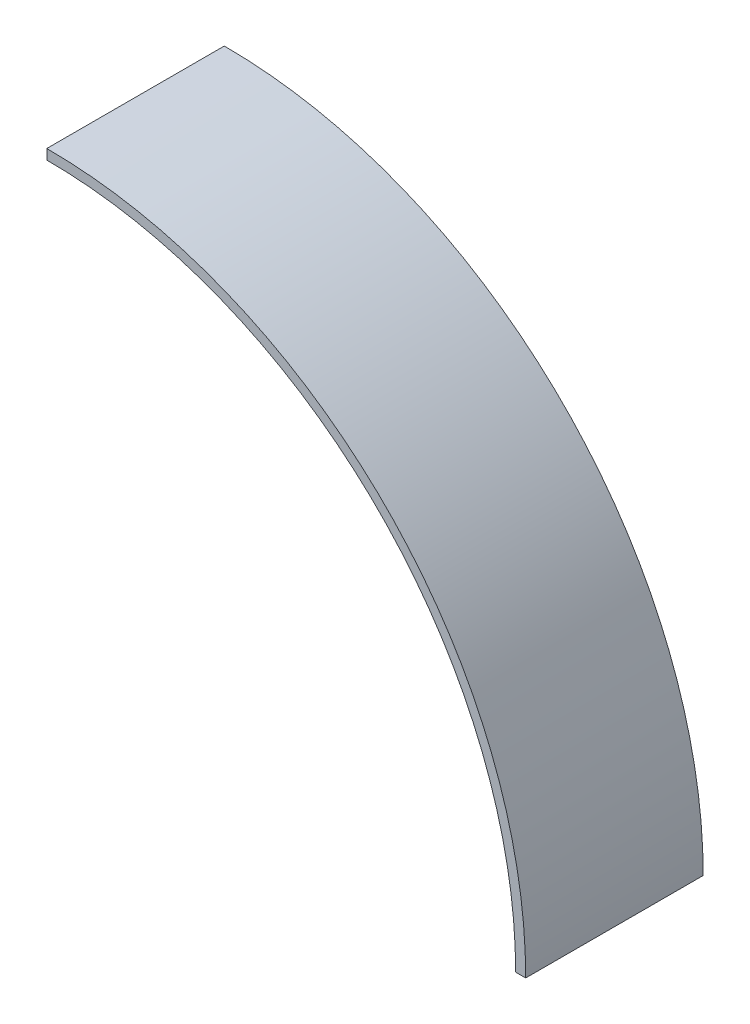
ISO-10303-21;
HEADER;
FILE_DESCRIPTION(('STEP AP214'),'2;1');
FILE_NAME('part.step','',(''),(''),'','','');
FILE_SCHEMA(('AUTOMOTIVE_DESIGN { 1 0 10303 214 1 1 1 1 }'));
ENDSEC;
DATA;
#1=APPLICATION_CONTEXT('core data for automotive mechanical design processes');
#2=APPLICATION_PROTOCOL_DEFINITION('international standard','automotive_design',2000,#1);
#3=PRODUCT_CONTEXT('',#1,'mechanical');
#4=PRODUCT('Part','Part','',(#3));
#5=PRODUCT_RELATED_PRODUCT_CATEGORY('part','',(#4));
#6=PRODUCT_DEFINITION_FORMATION('','',#4);
#7=PRODUCT_DEFINITION_CONTEXT('part definition',#1,'design');
#8=PRODUCT_DEFINITION('design','',#6,#7);
#9=PRODUCT_DEFINITION_SHAPE('','',#8);
#10=(LENGTH_UNIT() NAMED_UNIT(*) SI_UNIT(.MILLI.,.METRE.));
#11=(NAMED_UNIT(*) PLANE_ANGLE_UNIT() SI_UNIT($,.RADIAN.));
#12=(NAMED_UNIT(*) SI_UNIT($,.STERADIAN.) SOLID_ANGLE_UNIT());
#13=UNCERTAINTY_MEASURE_WITH_UNIT(LENGTH_MEASURE(1.E-05),#10,'distance_accuracy_value','');
#14=(GEOMETRIC_REPRESENTATION_CONTEXT(3) GLOBAL_UNCERTAINTY_ASSIGNED_CONTEXT((#13)) GLOBAL_UNIT_ASSIGNED_CONTEXT((#10,
#11,#12)) REPRESENTATION_CONTEXT('',''));
#15=CARTESIAN_POINT('',(0.,0.,0.));
#16=DIRECTION('',(0.,0.,1.));
#17=DIRECTION('',(1.,0.,0.));
#18=AXIS2_PLACEMENT_3D('',#15,#16,#17);
#19=CARTESIAN_POINT('',(199.01,190.,1.49999999999995));
#20=DIRECTION('',(0.,-1.,0.));
#21=DIRECTION('',(1.,0.,0.));
#22=AXIS2_PLACEMENT_3D('',#19,#20,#21);
#23=PLANE('',#22);
#24=DIRECTION('',(0.,0.,1.));
#25=VECTOR('',#24,1.);
#26=CARTESIAN_POINT('',(170.5,190.,872.));
#27=LINE('',#26,#25);
#28=CARTESIAN_POINT('',(170.5,190.,1.49999999999995));
#29=VERTEX_POINT('',#28);
#30=CARTESIAN_POINT('',(170.5,190.,28.));
#31=VERTEX_POINT('',#30);
#32=EDGE_CURVE('E43',#29,#31,#27,.T.);
#33=ORIENTED_EDGE('',*,*,#32,.T.);
#34=DIRECTION('',(1.,0.,0.));
#35=VECTOR('',#34,1.);
#36=CARTESIAN_POINT('',(99.,190.,28.));
#37=LINE('',#36,#35);
#38=CARTESIAN_POINT('',(169.,190.,28.));
#39=VERTEX_POINT('',#38);
#40=EDGE_CURVE('E94',#39,#31,#37,.T.);
#41=ORIENTED_EDGE('',*,*,#40,.F.);
#42=DIRECTION('',(0.,0.,1.));
#43=VECTOR('',#42,1.);
#44=CARTESIAN_POINT('',(169.,190.,0.));
#45=LINE('',#44,#43);
#46=CARTESIAN_POINT('',(169.,190.,1.49999999999995));
#47=VERTEX_POINT('',#46);
#48=EDGE_CURVE('E93',#47,#39,#45,.T.);
#49=ORIENTED_EDGE('',*,*,#48,.F.);
#50=DIRECTION('',(1.,0.,0.));
#51=VECTOR('',#50,1.);
#52=CARTESIAN_POINT('',(170.5,190.,1.49999999999995));
#53=LINE('',#52,#51);
#54=EDGE_CURVE('E85',#47,#29,#53,.T.);
#55=ORIENTED_EDGE('',*,*,#54,.T.);
#56=EDGE_LOOP('',(#33,#41,#49,#55));
#57=FACE_BOUND('',#56,.T.);
#58=ADVANCED_FACE('F39',(#57),#23,.T.);
#59=CARTESIAN_POINT('',(99.,190.,28.));
#60=DIRECTION('',(0.,0.,1.));
#61=DIRECTION('',(1.,0.,0.));
#62=AXIS2_PLACEMENT_3D('',#59,#60,#61);
#63=PLANE('',#62);
#64=CARTESIAN_POINT('',(99.,190.,28.));
#65=DIRECTION('',(0.,0.,1.));
#66=DIRECTION('',(1.,0.,0.));
#67=AXIS2_PLACEMENT_3D('',#64,#65,#66);
#68=CIRCLE('',#67,70.);
#69=CARTESIAN_POINT('',(99.,260.,28.));
#70=VERTEX_POINT('',#69);
#71=EDGE_CURVE('E101',#70,#39,#68,.F.);
#72=ORIENTED_EDGE('',*,*,#71,.T.);
#73=ORIENTED_EDGE('',*,*,#40,.T.);
#74=CARTESIAN_POINT('',(99.,190.,28.));
#75=DIRECTION('',(0.,0.,-1.));
#76=DIRECTION('',(-1.,0.,0.));
#77=AXIS2_PLACEMENT_3D('',#74,#75,#76);
#78=CIRCLE('',#77,71.5);
#79=CARTESIAN_POINT('',(99.,261.5,28.));
#80=VERTEX_POINT('',#79);
#81=EDGE_CURVE('E97',#31,#80,#78,.F.);
#82=ORIENTED_EDGE('',*,*,#81,.T.);
#83=DIRECTION('',(0.,-1.,0.));
#84=VECTOR('',#83,1.);
#85=CARTESIAN_POINT('',(99.,190.,28.));
#86=LINE('',#85,#84);
#87=EDGE_CURVE('E48',#80,#70,#86,.T.);
#88=ORIENTED_EDGE('',*,*,#87,.T.);
#89=EDGE_LOOP('',(#72,#73,#82,#88));
#90=FACE_BOUND('',#89,.T.);
#91=ADVANCED_FACE('F104',(#90),#63,.T.);
#92=CARTESIAN_POINT('',(170.5,190.,1.49999999999995));
#93=DIRECTION('',(0.,0.,1.));
#94=DIRECTION('',(1.,0.,0.));
#95=AXIS2_PLACEMENT_3D('',#92,#93,#94);
#96=PLANE('',#95);
#97=ORIENTED_EDGE('',*,*,#54,.F.);
#98=CARTESIAN_POINT('',(99.,190.,1.49999999999995));
#99=DIRECTION('',(0.,0.,1.));
#100=DIRECTION('',(1.,0.,0.));
#101=AXIS2_PLACEMENT_3D('',#98,#99,#100);
#102=CIRCLE('',#101,70.);
#103=CARTESIAN_POINT('',(99.,260.,1.49999999999995));
#104=VERTEX_POINT('',#103);
#105=EDGE_CURVE('E88',#104,#47,#102,.F.);
#106=ORIENTED_EDGE('',*,*,#105,.F.);
#107=DIRECTION('',(0.,-1.,0.));
#108=VECTOR('',#107,1.);
#109=CARTESIAN_POINT('',(99.,190.,1.49999999999995));
#110=LINE('',#109,#108);
#111=CARTESIAN_POINT('',(99.,261.5,1.49999999999997));
#112=VERTEX_POINT('',#111);
#113=EDGE_CURVE('E11',#112,#104,#110,.T.);
#114=ORIENTED_EDGE('',*,*,#113,.F.);
#115=CARTESIAN_POINT('',(99.,190.,1.49999999999995));
#116=DIRECTION('',(0.,0.,-1.));
#117=DIRECTION('',(-1.,0.,0.));
#118=AXIS2_PLACEMENT_3D('',#115,#116,#117);
#119=CIRCLE('',#118,71.5);
#120=EDGE_CURVE('E82',#112,#29,#119,.T.);
#121=ORIENTED_EDGE('',*,*,#120,.T.);
#122=EDGE_LOOP('',(#97,#106,#114,#121));
#123=FACE_BOUND('',#122,.T.);
#124=ADVANCED_FACE('F41',(#123),#96,.F.);
#125=CARTESIAN_POINT('',(99.,261.510103077641,898.5));
#126=DIRECTION('',(-1.,0.,0.));
#127=DIRECTION('',(0.,0.,1.));
#128=AXIS2_PLACEMENT_3D('',#125,#126,#127);
#129=PLANE('',#128);
#130=ORIENTED_EDGE('',*,*,#87,.F.);
#131=DIRECTION('',(0.,0.,-1.));
#132=VECTOR('',#131,1.);
#133=CARTESIAN_POINT('',(99.,261.5,28.));
#134=LINE('',#133,#132);
#135=EDGE_CURVE('E55',#112,#80,#134,.F.);
#136=ORIENTED_EDGE('',*,*,#135,.F.);
#137=ORIENTED_EDGE('',*,*,#113,.T.);
#138=DIRECTION('',(0.,0.,1.));
#139=VECTOR('',#138,1.);
#140=CARTESIAN_POINT('',(99.,260.,0.));
#141=LINE('',#140,#139);
#142=EDGE_CURVE('E63',#70,#104,#141,.F.);
#143=ORIENTED_EDGE('',*,*,#142,.F.);
#144=EDGE_LOOP('',(#130,#136,#137,#143));
#145=FACE_BOUND('',#144,.T.);
#146=ADVANCED_FACE('F114',(#145),#129,.T.);
#147=CARTESIAN_POINT('',(99.,190.,0.));
#148=DIRECTION('',(0.,0.,1.));
#149=DIRECTION('',(1.,0.,0.));
#150=AXIS2_PLACEMENT_3D('',#147,#148,#149);
#151=CYLINDRICAL_SURFACE('',#150,70.);
#152=ORIENTED_EDGE('',*,*,#142,.T.);
#153=ORIENTED_EDGE('',*,*,#105,.T.);
#154=ORIENTED_EDGE('',*,*,#48,.T.);
#155=ORIENTED_EDGE('',*,*,#71,.F.);
#156=EDGE_LOOP('',(#152,#153,#154,#155));
#157=FACE_BOUND('',#156,.T.);
#158=ADVANCED_FACE('F112',(#157),#151,.F.);
#159=CARTESIAN_POINT('',(99.,190.,28.));
#160=DIRECTION('',(0.,0.,-1.));
#161=DIRECTION('',(-1.,0.,0.));
#162=AXIS2_PLACEMENT_3D('',#159,#160,#161);
#163=CYLINDRICAL_SURFACE('',#162,71.5);
#164=ORIENTED_EDGE('',*,*,#81,.F.);
#165=ORIENTED_EDGE('',*,*,#32,.F.);
#166=ORIENTED_EDGE('',*,*,#120,.F.);
#167=ORIENTED_EDGE('',*,*,#135,.T.);
#168=EDGE_LOOP('',(#164,#165,#166,#167));
#169=FACE_BOUND('',#168,.T.);
#170=ADVANCED_FACE('F95',(#169),#163,.T.);
#171=CLOSED_SHELL('',(#58,#91,#124,#146,#158,#170));
#172=MANIFOLD_SOLID_BREP('B2',#171);
#173=ADVANCED_BREP_SHAPE_REPRESENTATION('',(#18,#172),#14);
#174=SHAPE_DEFINITION_REPRESENTATION(#9,#173);
ENDSEC;
END-ISO-10303-21;
